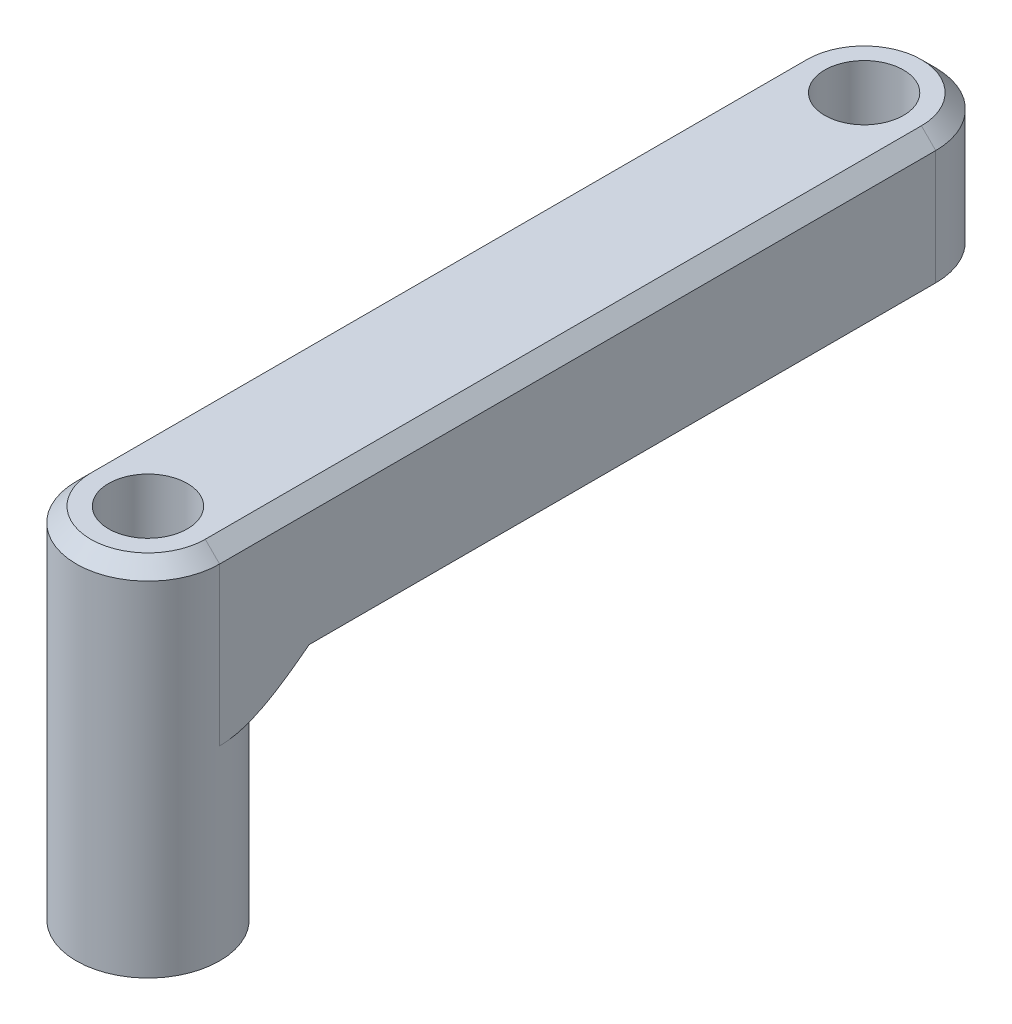
ISO-10303-21;
HEADER;
FILE_DESCRIPTION(('STEP AP214'),'2;1');
FILE_NAME('part.step','',(''),(''),'','','');
FILE_SCHEMA(('AUTOMOTIVE_DESIGN { 1 0 10303 214 1 1 1 1 }'));
ENDSEC;
DATA;
#1=APPLICATION_CONTEXT('core data for automotive mechanical design processes');
#2=APPLICATION_PROTOCOL_DEFINITION('international standard','automotive_design',2000,#1);
#3=PRODUCT_CONTEXT('',#1,'mechanical');
#4=PRODUCT('Part','Part','',(#3));
#5=PRODUCT_RELATED_PRODUCT_CATEGORY('part','',(#4));
#6=PRODUCT_DEFINITION_FORMATION('','',#4);
#7=PRODUCT_DEFINITION_CONTEXT('part definition',#1,'design');
#8=PRODUCT_DEFINITION('design','',#6,#7);
#9=PRODUCT_DEFINITION_SHAPE('','',#8);
#10=(LENGTH_UNIT() NAMED_UNIT(*) SI_UNIT(.MILLI.,.METRE.));
#11=(NAMED_UNIT(*) PLANE_ANGLE_UNIT() SI_UNIT($,.RADIAN.));
#12=(NAMED_UNIT(*) SI_UNIT($,.STERADIAN.) SOLID_ANGLE_UNIT());
#13=UNCERTAINTY_MEASURE_WITH_UNIT(LENGTH_MEASURE(1.E-05),#10,'distance_accuracy_value','');
#14=(GEOMETRIC_REPRESENTATION_CONTEXT(3) GLOBAL_UNCERTAINTY_ASSIGNED_CONTEXT((#13)) GLOBAL_UNIT_ASSIGNED_CONTEXT((#10,
#11,#12)) REPRESENTATION_CONTEXT('',''));
#15=CARTESIAN_POINT('',(0.,0.,0.));
#16=DIRECTION('',(0.,0.,1.));
#17=DIRECTION('',(1.,0.,0.));
#18=AXIS2_PLACEMENT_3D('',#15,#16,#17);
#19=CARTESIAN_POINT('',(0.,10.,0.));
#20=DIRECTION('',(0.,-1.,0.));
#21=DIRECTION('',(0.,0.,-1.));
#22=AXIS2_PLACEMENT_3D('',#19,#20,#21);
#23=CYLINDRICAL_SURFACE('',#22,4.99999999999991);
#24=DIRECTION('',(0.,-1.,0.));
#25=VECTOR('',#24,1.);
#26=CARTESIAN_POINT('',(5.,10.,0.));
#27=LINE('',#26,#25);
#28=CARTESIAN_POINT('',(5.,9.,0.));
#29=VERTEX_POINT('',#28);
#30=CARTESIAN_POINT('',(5.,-2.00000000000007,0.));
#31=VERTEX_POINT('',#30);
#32=EDGE_CURVE('E109',#29,#31,#27,.T.);
#33=ORIENTED_EDGE('',*,*,#32,.F.);
#34=CARTESIAN_POINT('',(0.,9.,0.));
#35=DIRECTION('',(0.,1.,0.));
#36=DIRECTION('',(0.,0.,1.));
#37=AXIS2_PLACEMENT_3D('',#34,#35,#36);
#38=CIRCLE('',#37,4.99999999999991);
#39=CARTESIAN_POINT('',(-4.99999999999983,9.,0.));
#40=VERTEX_POINT('',#39);
#41=EDGE_CURVE('E282',#29,#40,#38,.F.);
#42=ORIENTED_EDGE('',*,*,#41,.T.);
#43=DIRECTION('',(0.,-1.,0.));
#44=VECTOR('',#43,1.);
#45=CARTESIAN_POINT('',(-4.99999999999983,10.,0.));
#46=LINE('',#45,#44);
#47=CARTESIAN_POINT('',(-4.99999999999991,-2.00000000000007,0.));
#48=VERTEX_POINT('',#47);
#49=EDGE_CURVE('E126',#40,#48,#46,.T.);
#50=ORIENTED_EDGE('',*,*,#49,.T.);
#51=CARTESIAN_POINT('',(0.,-2.00000000000007,0.));
#52=DIRECTION('',(0.,1.,0.));
#53=DIRECTION('',(0.,0.,1.));
#54=AXIS2_PLACEMENT_3D('',#51,#52,#53);
#55=CIRCLE('',#54,4.99999999999991);
#56=EDGE_CURVE('E123',#48,#31,#55,.F.);
#57=ORIENTED_EDGE('',*,*,#56,.T.);
#58=EDGE_LOOP('',(#33,#42,#50,#57));
#59=FACE_BOUND('',#58,.T.);
#60=CARTESIAN_POINT('',(0.,-15.,0.));
#61=DIRECTION('',(0.,1.,0.));
#62=DIRECTION('',(0.,0.,1.));
#63=AXIS2_PLACEMENT_3D('',#60,#61,#62);
#64=CIRCLE('',#63,5.);
#65=CARTESIAN_POINT('',(0.,-15.,5.));
#66=VERTEX_POINT('',#65);
#67=EDGE_CURVE('E261',#66,#66,#64,.T.);
#68=ORIENTED_EDGE('',*,*,#67,.T.);
#69=EDGE_LOOP('',(#68));
#70=FACE_BOUND('',#69,.T.);
#71=ADVANCED_FACE('F36',(#59,#70),#23,.T.);
#72=CARTESIAN_POINT('',(5.,10.,0.));
#73=DIRECTION('',(-1.,0.,0.));
#74=DIRECTION('',(0.,0.,1.));
#75=AXIS2_PLACEMENT_3D('',#72,#73,#74);
#76=PLANE('',#75);
#77=DIRECTION('',(0.,-1.,0.));
#78=VECTOR('',#77,1.);
#79=CARTESIAN_POINT('',(4.99999999999983,10.,-50.));
#80=LINE('',#79,#78);
#81=CARTESIAN_POINT('',(4.99999999999983,9.,-50.));
#82=VERTEX_POINT('',#81);
#83=CARTESIAN_POINT('',(4.99999999999983,0.999999999999994,-50.));
#84=VERTEX_POINT('',#83);
#85=EDGE_CURVE('E120',#82,#84,#80,.T.);
#86=ORIENTED_EDGE('',*,*,#85,.F.);
#87=DIRECTION('',(0.,0.,1.));
#88=VECTOR('',#87,1.);
#89=CARTESIAN_POINT('',(5.,9.,0.));
#90=LINE('',#89,#88);
#91=EDGE_CURVE('E116',#82,#29,#90,.T.);
#92=ORIENTED_EDGE('',*,*,#91,.T.);
#93=ORIENTED_EDGE('',*,*,#32,.T.);
#94=CARTESIAN_POINT('',(4.99999999999991,-2.00000000000007,0.));
#95=CARTESIAN_POINT('',(4.99999999999997,-2.00000618930842,-0.0768631324548048));
#96=CARTESIAN_POINT('',(4.99999999999999,-1.99822673007758,-0.153714935456974));
#97=CARTESIAN_POINT('',(5.00000000000001,-1.99115472897628,-0.307244472929368));
#98=CARTESIAN_POINT('',(5.,-1.98586276415378,-0.383922233916025));
#99=CARTESIAN_POINT('',(4.99999999999999,-1.96483614680593,-0.613160433826684));
#100=CARTESIAN_POINT('',(5.,-1.94395024236154,-0.765273367139511));
#101=CARTESIAN_POINT('',(5.,-1.88999422254856,-1.06466920877923));
#102=CARTESIAN_POINT('',(5.,-1.85713125156517,-1.21199039344153));
#103=CARTESIAN_POINT('',(4.99999999999999,-1.78063865462097,-1.50385432629877));
#104=CARTESIAN_POINT('',(4.99999999999999,-1.73700341762583,-1.64839558406319));
#105=CARTESIAN_POINT('',(4.99999999999999,-1.59495243787675,-2.06959539092251));
#106=CARTESIAN_POINT('',(4.99999999999999,-1.48375259446494,-2.34194372862843));
#107=CARTESIAN_POINT('',(4.99999999999999,-1.23703397466318,-2.87539813107404));
#108=CARTESIAN_POINT('',(4.99999999999999,-1.10148307426974,-3.13648877352755));
#109=CARTESIAN_POINT('',(4.99999999999999,-0.811801419777525,-3.65237689300054));
#110=CARTESIAN_POINT('',(4.99999999999999,-0.657457565625411,-3.90705318865571));
#111=CARTESIAN_POINT('',(4.99999999999999,-0.33684202985588,-4.40848907282154));
#112=CARTESIAN_POINT('',(4.99999999999998,-0.170576924927434,-4.65525291934935));
#113=CARTESIAN_POINT('',(4.99999999999998,0.161370324718753,-5.12955132375472));
#114=CARTESIAN_POINT('',(4.99999999999998,0.326599583932542,-5.35740489778429));
#115=CARTESIAN_POINT('',(4.99999999999998,0.577640176854124,-5.69439333632251));
#116=CARTESIAN_POINT('',(4.99999999999998,0.661261888442723,-5.80517136529041));
#117=CARTESIAN_POINT('',(4.99999999999998,0.829742881605317,-6.02577233283772));
#118=CARTESIAN_POINT('',(4.99999999999998,0.914602089346671,-6.13559532777821));
#119=CARTESIAN_POINT('',(4.99999999999998,0.999999999999992,-6.24499799839844));
#120=B_SPLINE_CURVE_WITH_KNOTS('',3,(#94,#95,#96,#97,#98,#99,#100,#101,#102,#103,#104,#105,#106,
#107,#108,#109,#110,#111,#112,#113,#114,#115,#116,#117,#118,#119),.UNSPECIFIED.,.F.,.F.,(4,2,2,
2,2,2,2,2,2,2,2,2,4),(0.,0.2305471571487,0.461056448493288,0.921036231213898,1.37341138715853,
1.82602267429679,2.70661487383118,3.58837740046029,4.48128002986086,5.37369379965571,
6.21794104984236,6.63432271219743,7.05067963282544),.UNSPECIFIED.);
#121=CARTESIAN_POINT('',(4.99999999999998,0.999999999999994,-6.24499799839844));
#122=VERTEX_POINT('',#121);
#123=EDGE_CURVE('E114',#31,#122,#120,.T.);
#124=ORIENTED_EDGE('',*,*,#123,.T.);
#125=DIRECTION('',(0.,0.,-1.));
#126=VECTOR('',#125,1.);
#127=CARTESIAN_POINT('',(5.,0.999999999999994,0.));
#128=LINE('',#127,#126);
#129=EDGE_CURVE('E280',#122,#84,#128,.T.);
#130=ORIENTED_EDGE('',*,*,#129,.T.);
#131=EDGE_LOOP('',(#86,#92,#93,#124,#130));
#132=FACE_BOUND('',#131,.T.);
#133=ADVANCED_FACE('F112',(#132),#76,.F.);
#134=CARTESIAN_POINT('',(0.,10.,-50.));
#135=DIRECTION('',(0.,-1.,0.));
#136=DIRECTION('',(0.,0.,-1.));
#137=AXIS2_PLACEMENT_3D('',#134,#135,#136);
#138=CYLINDRICAL_SURFACE('',#137,4.99999999999991);
#139=DIRECTION('',(0.,-1.,0.));
#140=VECTOR('',#139,1.);
#141=CARTESIAN_POINT('',(-4.99999999999991,10.,-50.));
#142=LINE('',#141,#140);
#143=CARTESIAN_POINT('',(-4.99999999999991,9.,-50.));
#144=VERTEX_POINT('',#143);
#145=CARTESIAN_POINT('',(-4.99999999999991,0.999999999999994,-50.));
#146=VERTEX_POINT('',#145);
#147=EDGE_CURVE('E265',#144,#146,#142,.T.);
#148=ORIENTED_EDGE('',*,*,#147,.F.);
#149=CARTESIAN_POINT('',(0.,9.,-50.));
#150=DIRECTION('',(0.,1.,0.));
#151=DIRECTION('',(0.,0.,1.));
#152=AXIS2_PLACEMENT_3D('',#149,#150,#151);
#153=CIRCLE('',#152,4.99999999999991);
#154=EDGE_CURVE('E288',#144,#82,#153,.F.);
#155=ORIENTED_EDGE('',*,*,#154,.T.);
#156=ORIENTED_EDGE('',*,*,#85,.T.);
#157=CARTESIAN_POINT('',(0.,0.999999999999994,-50.));
#158=DIRECTION('',(0.,1.,0.));
#159=DIRECTION('',(0.,0.,1.));
#160=AXIS2_PLACEMENT_3D('',#157,#158,#159);
#161=CIRCLE('',#160,4.99999999999991);
#162=EDGE_CURVE('E291',#84,#146,#161,.T.);
#163=ORIENTED_EDGE('',*,*,#162,.T.);
#164=EDGE_LOOP('',(#148,#155,#156,#163));
#165=FACE_BOUND('',#164,.T.);
#166=ADVANCED_FACE('F207',(#165),#138,.T.);
#167=CARTESIAN_POINT('',(-5.,10.,-50.));
#168=DIRECTION('',(1.,0.,0.));
#169=DIRECTION('',(0.,0.,-1.));
#170=AXIS2_PLACEMENT_3D('',#167,#168,#169);
#171=PLANE('',#170);
#172=ORIENTED_EDGE('',*,*,#49,.F.);
#173=DIRECTION('',(0.,0.,-1.));
#174=VECTOR('',#173,1.);
#175=CARTESIAN_POINT('',(-5.,9.,-50.));
#176=LINE('',#175,#174);
#177=EDGE_CURVE('E284',#40,#144,#176,.T.);
#178=ORIENTED_EDGE('',*,*,#177,.T.);
#179=ORIENTED_EDGE('',*,*,#147,.T.);
#180=DIRECTION('',(0.,0.,1.));
#181=VECTOR('',#180,1.);
#182=CARTESIAN_POINT('',(-5.,0.999999999999994,-50.));
#183=LINE('',#182,#181);
#184=CARTESIAN_POINT('',(-4.99999999999985,0.999999999999994,-6.24499799839854));
#185=VERTEX_POINT('',#184);
#186=EDGE_CURVE('E286',#146,#185,#183,.T.);
#187=ORIENTED_EDGE('',*,*,#186,.T.);
#188=CARTESIAN_POINT('',(-4.99999999999985,0.999999999999995,-6.24499799839854));
#189=CARTESIAN_POINT('',(-4.99999999999985,0.914824811081742,-6.1358777821942));
#190=CARTESIAN_POINT('',(-4.99999999999985,0.830181970432057,-6.02633913438047));
#191=CARTESIAN_POINT('',(-4.99999999999985,0.662124013446074,-5.80630827457821));
#192=CARTESIAN_POINT('',(-4.99999999999985,0.57870901280285,-5.69581597426834));
#193=CARTESIAN_POINT('',(-4.99999999999985,0.411713893947632,-5.4716716880127));
#194=CARTESIAN_POINT('',(-4.99999999999985,0.328160764495853,-5.35799956031912));
#195=CARTESIAN_POINT('',(-4.99999999999985,0.162746331753054,-5.12943999735122));
#196=CARTESIAN_POINT('',(-4.99999999999984,0.080884931245297,-5.01455263248846));
#197=CARTESIAN_POINT('',(-4.99999999999984,-0.100410563572271,-4.75550696679715));
#198=CARTESIAN_POINT('',(-4.99999999999984,-0.19931631549396,-4.61097760694526));
#199=CARTESIAN_POINT('',(-4.99999999999984,-0.393484158002248,-4.31947586105539));
#200=CARTESIAN_POINT('',(-4.99999999999984,-0.488746099727788,-4.17250337555921));
#201=CARTESIAN_POINT('',(-4.99999999999984,-0.674934523649866,-3.87554577779448));
#202=CARTESIAN_POINT('',(-4.99999999999984,-0.765854899444623,-3.72555682088076));
#203=CARTESIAN_POINT('',(-4.99999999999984,-0.942169626681671,-3.42235623472593));
#204=CARTESIAN_POINT('',(-4.99999999999984,-1.02756421189594,-3.26914474218002));
#205=CARTESIAN_POINT('',(-4.99999999999984,-1.19010443142426,-2.96169285311556));
#206=CARTESIAN_POINT('',(-4.99999999999984,-1.26736516594181,-2.80751369934316));
#207=CARTESIAN_POINT('',(-4.99999999999984,-1.41366366356225,-2.49523166131622));
#208=CARTESIAN_POINT('',(-4.99999999999984,-1.48269989621508,-2.33712805337623));
#209=CARTESIAN_POINT('',(-4.99999999999984,-1.61038045565175,-2.01728309249627));
#210=CARTESIAN_POINT('',(-4.99999999999984,-1.66905492116922,-1.85555388499078));
#211=CARTESIAN_POINT('',(-4.99999999999983,-1.77397926426921,-1.52816112747386));
#212=CARTESIAN_POINT('',(-4.99999999999983,-1.82023807053589,-1.36250049855406));
#213=CARTESIAN_POINT('',(-4.99999999999983,-1.88176414642037,-1.09786256585503));
#214=CARTESIAN_POINT('',(-4.99999999999983,-1.90189818973871,-1.0000046879731));
#215=CARTESIAN_POINT('',(-4.99999999999983,-1.93680324424453,-0.803322389501409));
#216=CARTESIAN_POINT('',(-4.99999999999983,-1.95157404475839,-0.704497931099937));
#217=CARTESIAN_POINT('',(-4.99999999999983,-1.97555495063107,-0.504936338506765));
#218=CARTESIAN_POINT('',(-4.99999999999983,-1.98469429637733,-0.404190640835993));
#219=CARTESIAN_POINT('',(-4.99999999999983,-1.99693102740515,-0.202300251554054));
#220=CARTESIAN_POINT('',(-4.99999999999983,-2.00002635287053,-0.10115543568569));
#221=CARTESIAN_POINT('',(-4.99999999999983,-2.00000000000016,0.));
#222=B_SPLINE_CURVE_WITH_KNOTS('',3,(#188,#189,#190,#191,#192,#193,#194,#195,#196,#197,#198,
#199,#200,#201,#202,#203,#204,#205,#206,#207,#208,#209,#210,#211,#212,#213,#214,#215,#216,#217,
#218,#219,#220,#221),.UNSPECIFIED.,.F.,.F.,(4,2,2,2,2,2,2,2,2,2,2,2,2,2,2,2,4),(0.,
0.415282689923067,0.830604262503297,1.25381876639432,1.67700888186915,2.20235714314388,
2.72772684366769,3.25381493189485,3.77988074907038,4.29704796069104,4.81431125914774,
5.33004431003654,5.84540547319191,6.14500050902896,6.44460731199007,6.74790577143557,
7.05130757767373),.UNSPECIFIED.);
#223=EDGE_CURVE('E129',#185,#48,#222,.T.);
#224=ORIENTED_EDGE('',*,*,#223,.T.);
#225=EDGE_LOOP('',(#172,#178,#179,#187,#224));
#226=FACE_BOUND('',#225,.T.);
#227=ADVANCED_FACE('F211',(#226),#171,.F.);
#228=CARTESIAN_POINT('',(0.,10.,0.));
#229=DIRECTION('',(0.,1.,0.));
#230=DIRECTION('',(0.,0.,1.));
#231=AXIS2_PLACEMENT_3D('',#228,#229,#230);
#232=PLANE('',#231);
#233=DIRECTION('',(0.,0.,-1.));
#234=VECTOR('',#233,1.);
#235=CARTESIAN_POINT('',(3.99999999999983,10.,-50.));
#236=LINE('',#235,#234);
#237=CARTESIAN_POINT('',(4.00000000000001,10.,0.));
#238=VERTEX_POINT('',#237);
#239=CARTESIAN_POINT('',(3.99999999999983,10.,-50.));
#240=VERTEX_POINT('',#239);
#241=EDGE_CURVE('E135',#238,#240,#236,.T.);
#242=ORIENTED_EDGE('',*,*,#241,.T.);
#243=CARTESIAN_POINT('',(0.,10.,-50.));
#244=DIRECTION('',(0.,1.,0.));
#245=DIRECTION('',(0.,0.,1.));
#246=AXIS2_PLACEMENT_3D('',#243,#244,#245);
#247=CIRCLE('',#246,3.99999999999992);
#248=CARTESIAN_POINT('',(-4.00000000000001,10.,-50.));
#249=VERTEX_POINT('',#248);
#250=EDGE_CURVE('E293',#240,#249,#247,.T.);
#251=ORIENTED_EDGE('',*,*,#250,.T.);
#252=DIRECTION('',(0.,0.,1.));
#253=VECTOR('',#252,1.);
#254=CARTESIAN_POINT('',(-3.99999999999983,10.,0.));
#255=LINE('',#254,#253);
#256=CARTESIAN_POINT('',(-3.99999999999992,10.,0.));
#257=VERTEX_POINT('',#256);
#258=EDGE_CURVE('E296',#249,#257,#255,.T.);
#259=ORIENTED_EDGE('',*,*,#258,.T.);
#260=CARTESIAN_POINT('',(0.,10.,0.));
#261=DIRECTION('',(0.,1.,0.));
#262=DIRECTION('',(0.,0.,1.));
#263=AXIS2_PLACEMENT_3D('',#260,#261,#262);
#264=CIRCLE('',#263,3.99999999999992);
#265=EDGE_CURVE('E137',#257,#238,#264,.T.);
#266=ORIENTED_EDGE('',*,*,#265,.T.);
#267=EDGE_LOOP('',(#242,#251,#259,#266));
#268=FACE_BOUND('',#267,.T.);
#269=CARTESIAN_POINT('',(0.,10.,-50.));
#270=DIRECTION('',(0.,1.,0.));
#271=DIRECTION('',(0.,0.,1.));
#272=AXIS2_PLACEMENT_3D('',#269,#270,#271);
#273=CIRCLE('',#272,2.75);
#274=CARTESIAN_POINT('',(0.,10.,-47.25));
#275=VERTEX_POINT('',#274);
#276=EDGE_CURVE('E246',#275,#275,#273,.T.);
#277=ORIENTED_EDGE('',*,*,#276,.F.);
#278=EDGE_LOOP('',(#277));
#279=FACE_BOUND('',#278,.T.);
#280=CARTESIAN_POINT('',(0.,10.,0.));
#281=DIRECTION('',(0.,1.,0.));
#282=DIRECTION('',(0.,0.,1.));
#283=AXIS2_PLACEMENT_3D('',#280,#281,#282);
#284=CIRCLE('',#283,2.75);
#285=CARTESIAN_POINT('',(0.,10.,2.75));
#286=VERTEX_POINT('',#285);
#287=EDGE_CURVE('E250',#286,#286,#284,.T.);
#288=ORIENTED_EDGE('',*,*,#287,.F.);
#289=EDGE_LOOP('',(#288));
#290=FACE_BOUND('',#289,.T.);
#291=ADVANCED_FACE('F216',(#268,#279,#290),#232,.T.);
#292=CARTESIAN_POINT('',(0.,0.,0.));
#293=DIRECTION('',(0.,1.,0.));
#294=DIRECTION('',(0.,0.,1.));
#295=AXIS2_PLACEMENT_3D('',#292,#293,#294);
#296=PLANE('',#295);
#297=CARTESIAN_POINT('',(0.,0.,-50.));
#298=DIRECTION('',(0.,1.,0.));
#299=DIRECTION('',(0.,0.,1.));
#300=AXIS2_PLACEMENT_3D('',#297,#298,#299);
#301=CIRCLE('',#300,2.75);
#302=CARTESIAN_POINT('',(0.,0.,-47.25));
#303=VERTEX_POINT('',#302);
#304=EDGE_CURVE('E243',#303,#303,#301,.F.);
#305=ORIENTED_EDGE('',*,*,#304,.F.);
#306=EDGE_LOOP('',(#305));
#307=FACE_BOUND('',#306,.T.);
#308=CARTESIAN_POINT('',(0.,0.,0.));
#309=DIRECTION('',(0.,1.,0.));
#310=DIRECTION('',(0.,0.,1.));
#311=AXIS2_PLACEMENT_3D('',#308,#309,#310);
#312=CIRCLE('',#311,7.00000000000001);
#313=CARTESIAN_POINT('',(3.99999999999998,0.,-5.74456264653806));
#314=VERTEX_POINT('',#313);
#315=CARTESIAN_POINT('',(-3.99999999999985,0.,-5.74456264653815));
#316=VERTEX_POINT('',#315);
#317=EDGE_CURVE('E119',#314,#316,#312,.T.);
#318=ORIENTED_EDGE('',*,*,#317,.T.);
#319=DIRECTION('',(0.,0.,-1.));
#320=VECTOR('',#319,1.);
#321=CARTESIAN_POINT('',(-3.99999999999983,0.,0.));
#322=LINE('',#321,#320);
#323=CARTESIAN_POINT('',(-3.99999999999991,0.,-50.));
#324=VERTEX_POINT('',#323);
#325=EDGE_CURVE('E55',#316,#324,#322,.T.);
#326=ORIENTED_EDGE('',*,*,#325,.T.);
#327=CARTESIAN_POINT('',(0.,0.,-50.));
#328=DIRECTION('',(0.,1.,0.));
#329=DIRECTION('',(0.,0.,1.));
#330=AXIS2_PLACEMENT_3D('',#327,#328,#329);
#331=CIRCLE('',#330,3.99999999999991);
#332=CARTESIAN_POINT('',(3.99999999999983,0.,-50.));
#333=VERTEX_POINT('',#332);
#334=EDGE_CURVE('E59',#324,#333,#331,.F.);
#335=ORIENTED_EDGE('',*,*,#334,.T.);
#336=DIRECTION('',(0.,0.,1.));
#337=VECTOR('',#336,1.);
#338=CARTESIAN_POINT('',(4.,0.,0.));
#339=LINE('',#338,#337);
#340=EDGE_CURVE('E270',#333,#314,#339,.T.);
#341=ORIENTED_EDGE('',*,*,#340,.T.);
#342=EDGE_LOOP('',(#318,#326,#335,#341));
#343=FACE_BOUND('',#342,.T.);
#344=ADVANCED_FACE('F221',(#307,#343),#296,.F.);
#345=CARTESIAN_POINT('',(0.,-15.,0.));
#346=DIRECTION('',(0.,1.,0.));
#347=DIRECTION('',(0.,0.,1.));
#348=AXIS2_PLACEMENT_3D('',#345,#346,#347);
#349=PLANE('',#348);
#350=CARTESIAN_POINT('',(0.,-15.,0.));
#351=DIRECTION('',(0.,1.,0.));
#352=DIRECTION('',(0.,0.,1.));
#353=AXIS2_PLACEMENT_3D('',#350,#351,#352);
#354=CIRCLE('',#353,2.75);
#355=CARTESIAN_POINT('',(0.,-15.,2.75));
#356=VERTEX_POINT('',#355);
#357=EDGE_CURVE('E258',#356,#356,#354,.F.);
#358=ORIENTED_EDGE('',*,*,#357,.F.);
#359=EDGE_LOOP('',(#358));
#360=FACE_BOUND('',#359,.T.);
#361=ORIENTED_EDGE('',*,*,#67,.F.);
#362=EDGE_LOOP('',(#361));
#363=FACE_BOUND('',#362,.T.);
#364=ADVANCED_FACE('F224',(#360,#363),#349,.F.);
#365=CARTESIAN_POINT('',(0.,-22.778174593052,0.));
#366=DIRECTION('',(0.,1.,0.));
#367=DIRECTION('',(0.,0.,1.));
#368=AXIS2_PLACEMENT_3D('',#365,#366,#367);
#369=CYLINDRICAL_SURFACE('',#368,2.75);
#370=ORIENTED_EDGE('',*,*,#357,.T.);
#371=EDGE_LOOP('',(#370));
#372=FACE_BOUND('',#371,.T.);
#373=ORIENTED_EDGE('',*,*,#287,.T.);
#374=EDGE_LOOP('',(#373));
#375=FACE_BOUND('',#374,.T.);
#376=ADVANCED_FACE('F231',(#372,#375),#369,.F.);
#377=CARTESIAN_POINT('',(0.,-7.77817459305202,-50.));
#378=DIRECTION('',(0.,1.,0.));
#379=DIRECTION('',(0.,0.,1.));
#380=AXIS2_PLACEMENT_3D('',#377,#378,#379);
#381=CYLINDRICAL_SURFACE('',#380,2.75);
#382=ORIENTED_EDGE('',*,*,#304,.T.);
#383=EDGE_LOOP('',(#382));
#384=FACE_BOUND('',#383,.T.);
#385=ORIENTED_EDGE('',*,*,#276,.T.);
#386=EDGE_LOOP('',(#385));
#387=FACE_BOUND('',#386,.T.);
#388=ADVANCED_FACE('F163',(#384,#387),#381,.F.);
#389=CARTESIAN_POINT('',(0.,0.,0.));
#390=DIRECTION('',(0.,1.,0.));
#391=DIRECTION('',(0.,0.,1.));
#392=AXIS2_PLACEMENT_3D('',#389,#390,#391);
#393=CONICAL_SURFACE('',#392,7.00000000000001,0.785398163397454);
#394=ORIENTED_EDGE('',*,*,#123,.F.);
#395=ORIENTED_EDGE('',*,*,#56,.F.);
#396=ORIENTED_EDGE('',*,*,#223,.F.);
#397=CARTESIAN_POINT('',(-4.99999999999985,0.999999999999994,-6.24499799839854));
#398=CARTESIAN_POINT('',(-4.91629647388374,0.916296473883887,-6.20478750795509));
#399=CARTESIAN_POINT('',(-4.83267613708591,0.83267613708606,-6.16422985605596));
#400=CARTESIAN_POINT('',(-4.66561862269412,0.665618622694273,-6.08238343609931));
#401=CARTESIAN_POINT('',(-4.58218143736827,0.582181437368419,-6.0410946995993));
#402=CARTESIAN_POINT('',(-4.41549921723093,0.415499217231083,-5.95774557166051));
#403=CARTESIAN_POINT('',(-4.33225418375689,0.332254183757036,-5.91568517486886));
#404=CARTESIAN_POINT('',(-4.16596879359244,0.165968793592589,-5.83074729371111));
#405=CARTESIAN_POINT('',(-4.08292844587183,0.0829284458719825,-5.78786977423129));
#406=CARTESIAN_POINT('',(-3.99999999999985,0.,-5.74456264653815));
#407=B_SPLINE_CURVE_WITH_KNOTS('',3,(#397,#398,#399,#400,#401,#402,#403,#404,#405,#406),
.UNSPECIFIED.,.F.,.F.,(4,2,2,2,4),(0.,0.375053167279845,0.750090184546252,1.12512980436007,
1.50018557702798),.UNSPECIFIED.);
#408=EDGE_CURVE('E47',#185,#316,#407,.T.);
#409=ORIENTED_EDGE('',*,*,#408,.T.);
#410=ORIENTED_EDGE('',*,*,#317,.F.);
#411=CARTESIAN_POINT('',(3.99999999999998,0.,-5.74456264653806));
#412=CARTESIAN_POINT('',(4.08292844587196,0.082928445871983,-5.7878697742312));
#413=CARTESIAN_POINT('',(4.16596879359257,0.16596879359259,-5.83074729371102));
#414=CARTESIAN_POINT('',(4.33225418375702,0.332254183757036,-5.91568517486876));
#415=CARTESIAN_POINT('',(4.41549921723106,0.415499217231083,-5.95774557166041));
#416=CARTESIAN_POINT('',(4.5821814373684,0.582181437368418,-6.0410946995992));
#417=CARTESIAN_POINT('',(4.66561862269426,0.665618622694272,-6.08238343609922));
#418=CARTESIAN_POINT('',(4.83267613708604,0.832676137086059,-6.16422985605586));
#419=CARTESIAN_POINT('',(4.91629647388387,0.916296473883887,-6.20478750795499));
#420=CARTESIAN_POINT('',(4.99999999999998,0.999999999999994,-6.24499799839844));
#421=B_SPLINE_CURVE_WITH_KNOTS('',3,(#411,#412,#413,#414,#415,#416,#417,#418,#419,#420),
.UNSPECIFIED.,.F.,.F.,(4,2,2,2,4),(0.,0.375055772667904,0.750095392481722,1.12513240974813,
1.50018557702797),.UNSPECIFIED.);
#422=EDGE_CURVE('E11',#314,#122,#421,.T.);
#423=ORIENTED_EDGE('',*,*,#422,.T.);
#424=EDGE_LOOP('',(#394,#395,#396,#409,#410,#423));
#425=FACE_BOUND('',#424,.T.);
#426=ADVANCED_FACE('F131',(#425),#393,.T.);
#427=CARTESIAN_POINT('',(0.,10.,0.));
#428=DIRECTION('',(0.,-1.,0.));
#429=DIRECTION('',(0.,0.,-1.));
#430=AXIS2_PLACEMENT_3D('',#427,#428,#429);
#431=CONICAL_SURFACE('',#430,3.99999999999992,0.785398163397445);
#432=DIRECTION('',(0.707106781186545,0.70710678118655,0.));
#433=VECTOR('',#432,1.);
#434=CARTESIAN_POINT('',(-4.99999999999991,9.,0.));
#435=LINE('',#434,#433);
#436=EDGE_CURVE('E253',#40,#257,#435,.T.);
#437=ORIENTED_EDGE('',*,*,#436,.F.);
#438=ORIENTED_EDGE('',*,*,#41,.F.);
#439=DIRECTION('',(0.707106781186545,-0.70710678118655,0.));
#440=VECTOR('',#439,1.);
#441=CARTESIAN_POINT('',(3.99999999999992,10.,0.));
#442=LINE('',#441,#440);
#443=EDGE_CURVE('E248',#238,#29,#442,.T.);
#444=ORIENTED_EDGE('',*,*,#443,.F.);
#445=ORIENTED_EDGE('',*,*,#265,.F.);
#446=EDGE_LOOP('',(#437,#438,#444,#445));
#447=FACE_BOUND('',#446,.T.);
#448=ADVANCED_FACE('F162',(#447),#431,.T.);
#449=CARTESIAN_POINT('',(4.00000000000001,10.,0.));
#450=DIRECTION('',(0.70710678118655,0.707106781186545,0.));
#451=DIRECTION('',(0.,0.,1.));
#452=AXIS2_PLACEMENT_3D('',#449,#450,#451);
#453=PLANE('',#452);
#454=ORIENTED_EDGE('',*,*,#443,.T.);
#455=ORIENTED_EDGE('',*,*,#91,.F.);
#456=DIRECTION('',(0.707106781186545,-0.70710678118655,0.));
#457=VECTOR('',#456,1.);
#458=CARTESIAN_POINT('',(3.99999999999983,10.,-50.));
#459=LINE('',#458,#457);
#460=EDGE_CURVE('E307',#240,#82,#459,.T.);
#461=ORIENTED_EDGE('',*,*,#460,.F.);
#462=ORIENTED_EDGE('',*,*,#241,.F.);
#463=EDGE_LOOP('',(#454,#455,#461,#462));
#464=FACE_BOUND('',#463,.T.);
#465=ADVANCED_FACE('F306',(#464),#453,.T.);
#466=CARTESIAN_POINT('',(-3.99999999999983,10.,0.));
#467=DIRECTION('',(-0.70710678118655,0.707106781186545,0.));
#468=DIRECTION('',(0.,0.,-1.));
#469=AXIS2_PLACEMENT_3D('',#466,#467,#468);
#470=PLANE('',#469);
#471=ORIENTED_EDGE('',*,*,#436,.T.);
#472=ORIENTED_EDGE('',*,*,#258,.F.);
#473=DIRECTION('',(0.707106781186545,0.70710678118655,0.));
#474=VECTOR('',#473,1.);
#475=CARTESIAN_POINT('',(-5.,9.,-50.));
#476=LINE('',#475,#474);
#477=EDGE_CURVE('E311',#144,#249,#476,.T.);
#478=ORIENTED_EDGE('',*,*,#477,.F.);
#479=ORIENTED_EDGE('',*,*,#177,.F.);
#480=EDGE_LOOP('',(#471,#472,#478,#479));
#481=FACE_BOUND('',#480,.T.);
#482=ADVANCED_FACE('F316',(#481),#470,.T.);
#483=CARTESIAN_POINT('',(0.,10.,-50.));
#484=DIRECTION('',(0.,-1.,0.));
#485=DIRECTION('',(0.,0.,-1.));
#486=AXIS2_PLACEMENT_3D('',#483,#484,#485);
#487=CONICAL_SURFACE('',#486,3.99999999999992,0.785398163397445);
#488=ORIENTED_EDGE('',*,*,#460,.T.);
#489=ORIENTED_EDGE('',*,*,#154,.F.);
#490=ORIENTED_EDGE('',*,*,#477,.T.);
#491=ORIENTED_EDGE('',*,*,#250,.F.);
#492=EDGE_LOOP('',(#488,#489,#490,#491));
#493=FACE_BOUND('',#492,.T.);
#494=ADVANCED_FACE('F165',(#493),#487,.T.);
#495=CARTESIAN_POINT('',(5.,0.999999999999994,0.));
#496=DIRECTION('',(-0.707106781186545,0.70710678118655,0.));
#497=DIRECTION('',(0.,0.,-1.));
#498=AXIS2_PLACEMENT_3D('',#495,#496,#497);
#499=PLANE('',#498);
#500=ORIENTED_EDGE('',*,*,#422,.F.);
#501=ORIENTED_EDGE('',*,*,#340,.F.);
#502=DIRECTION('',(-0.70710678118655,-0.707106781186545,0.));
#503=VECTOR('',#502,1.);
#504=CARTESIAN_POINT('',(4.99999999999983,0.999999999999994,-50.));
#505=LINE('',#504,#503);
#506=EDGE_CURVE('E42',#84,#333,#505,.T.);
#507=ORIENTED_EDGE('',*,*,#506,.F.);
#508=ORIENTED_EDGE('',*,*,#129,.F.);
#509=EDGE_LOOP('',(#500,#501,#507,#508));
#510=FACE_BOUND('',#509,.T.);
#511=ADVANCED_FACE('F39',(#510),#499,.F.);
#512=CARTESIAN_POINT('',(0.,0.999999999999994,-50.));
#513=DIRECTION('',(0.,1.,0.));
#514=DIRECTION('',(0.,0.,1.));
#515=AXIS2_PLACEMENT_3D('',#512,#513,#514);
#516=CONICAL_SURFACE('',#515,4.99999999999991,0.785398163397452);
#517=ORIENTED_EDGE('',*,*,#506,.T.);
#518=ORIENTED_EDGE('',*,*,#334,.F.);
#519=DIRECTION('',(0.70710678118655,-0.707106781186545,0.));
#520=VECTOR('',#519,1.);
#521=CARTESIAN_POINT('',(-4.99999999999991,0.999999999999994,-50.));
#522=LINE('',#521,#520);
#523=EDGE_CURVE('E276',#146,#324,#522,.T.);
#524=ORIENTED_EDGE('',*,*,#523,.F.);
#525=ORIENTED_EDGE('',*,*,#162,.F.);
#526=EDGE_LOOP('',(#517,#518,#524,#525));
#527=FACE_BOUND('',#526,.T.);
#528=ADVANCED_FACE('F191',(#527),#516,.T.);
#529=CARTESIAN_POINT('',(-5.,0.999999999999994,-50.));
#530=DIRECTION('',(0.707106781186545,0.70710678118655,0.));
#531=DIRECTION('',(0.,0.,1.));
#532=AXIS2_PLACEMENT_3D('',#529,#530,#531);
#533=PLANE('',#532);
#534=ORIENTED_EDGE('',*,*,#523,.T.);
#535=ORIENTED_EDGE('',*,*,#325,.F.);
#536=ORIENTED_EDGE('',*,*,#408,.F.);
#537=ORIENTED_EDGE('',*,*,#186,.F.);
#538=EDGE_LOOP('',(#534,#535,#536,#537));
#539=FACE_BOUND('',#538,.T.);
#540=ADVANCED_FACE('F184',(#539),#533,.F.);
#541=CLOSED_SHELL('',(#71,#133,#166,#227,#291,#344,#364,#376,#388,#426,#448,#465,#482,#494,#511,
#528,#540));
#542=MANIFOLD_SOLID_BREP('B2',#541);
#543=ADVANCED_BREP_SHAPE_REPRESENTATION('',(#18,#542),#14);
#544=SHAPE_DEFINITION_REPRESENTATION(#9,#543);
ENDSEC;
END-ISO-10303-21;
